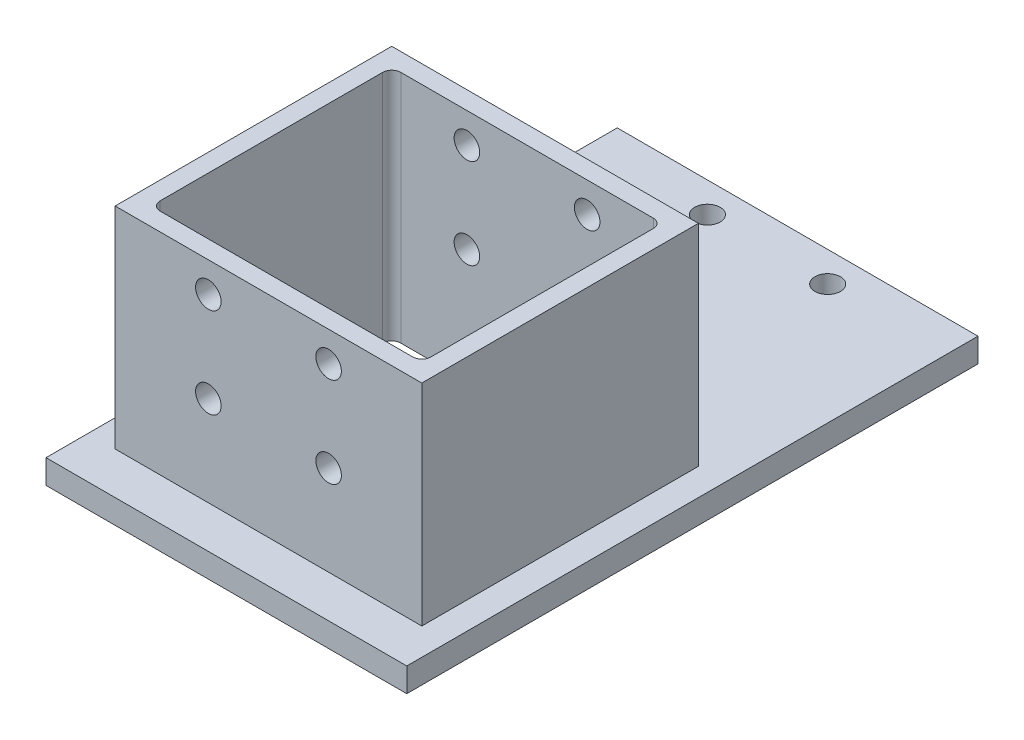
ISO-10303-21;
HEADER;
FILE_DESCRIPTION(('STEP AP214'),'2;1');
FILE_NAME('part.step','',(''),(''),'','','');
FILE_SCHEMA(('AUTOMOTIVE_DESIGN { 1 0 10303 214 1 1 1 1 }'));
ENDSEC;
DATA;
#1=APPLICATION_CONTEXT('core data for automotive mechanical design processes');
#2=APPLICATION_PROTOCOL_DEFINITION('international standard','automotive_design',2000,#1);
#3=PRODUCT_CONTEXT('',#1,'mechanical');
#4=PRODUCT('Part','Part','',(#3));
#5=PRODUCT_RELATED_PRODUCT_CATEGORY('part','',(#4));
#6=PRODUCT_DEFINITION_FORMATION('','',#4);
#7=PRODUCT_DEFINITION_CONTEXT('part definition',#1,'design');
#8=PRODUCT_DEFINITION('design','',#6,#7);
#9=PRODUCT_DEFINITION_SHAPE('','',#8);
#10=(LENGTH_UNIT() NAMED_UNIT(*) SI_UNIT(.MILLI.,.METRE.));
#11=(NAMED_UNIT(*) PLANE_ANGLE_UNIT() SI_UNIT($,.RADIAN.));
#12=(NAMED_UNIT(*) SI_UNIT($,.STERADIAN.) SOLID_ANGLE_UNIT());
#13=UNCERTAINTY_MEASURE_WITH_UNIT(LENGTH_MEASURE(1.E-05),#10,'distance_accuracy_value','');
#14=(GEOMETRIC_REPRESENTATION_CONTEXT(3) GLOBAL_UNCERTAINTY_ASSIGNED_CONTEXT((#13)) GLOBAL_UNIT_ASSIGNED_CONTEXT((#10,
#11,#12)) REPRESENTATION_CONTEXT('',''));
#15=CARTESIAN_POINT('',(0.,0.,0.));
#16=DIRECTION('',(0.,0.,1.));
#17=DIRECTION('',(1.,0.,0.));
#18=AXIS2_PLACEMENT_3D('',#15,#16,#17);
#19=CARTESIAN_POINT('',(0.,8.,0.));
#20=DIRECTION('',(0.,1.,0.));
#21=DIRECTION('',(0.,0.,1.));
#22=AXIS2_PLACEMENT_3D('',#19,#20,#21);
#23=PLANE('',#22);
#24=CARTESIAN_POINT('',(-20.,8.,-25.));
#25=DIRECTION('',(0.,1.,0.));
#26=DIRECTION('',(0.,0.,-1.));
#27=AXIS2_PLACEMENT_3D('',#24,#25,#26);
#28=CIRCLE('',#27,4.25);
#29=CARTESIAN_POINT('',(-20.,8.,-29.25));
#30=VERTEX_POINT('',#29);
#31=EDGE_CURVE('E177',#30,#30,#28,.T.);
#32=ORIENTED_EDGE('',*,*,#31,.F.);
#33=EDGE_LOOP('',(#32));
#34=FACE_BOUND('',#33,.T.);
#35=CARTESIAN_POINT('',(20.,8.,-25.));
#36=DIRECTION('',(0.,1.,0.));
#37=DIRECTION('',(0.,0.,1.));
#38=AXIS2_PLACEMENT_3D('',#35,#36,#37);
#39=CIRCLE('',#38,4.25);
#40=CARTESIAN_POINT('',(20.,8.,-20.75));
#41=VERTEX_POINT('',#40);
#42=EDGE_CURVE('E204',#41,#41,#39,.T.);
#43=ORIENTED_EDGE('',*,*,#42,.F.);
#44=EDGE_LOOP('',(#43));
#45=FACE_BOUND('',#44,.T.);
#46=DIRECTION('',(0.,0.,1.));
#47=VECTOR('',#46,1.);
#48=CARTESIAN_POINT('',(-60.,8.,-95.));
#49=LINE('',#48,#47);
#50=CARTESIAN_POINT('',(-60.,8.,-95.));
#51=VERTEX_POINT('',#50);
#52=CARTESIAN_POINT('',(-60.,8.,95.));
#53=VERTEX_POINT('',#52);
#54=EDGE_CURVE('E216',#51,#53,#49,.T.);
#55=ORIENTED_EDGE('',*,*,#54,.T.);
#56=DIRECTION('',(1.,0.,0.));
#57=VECTOR('',#56,1.);
#58=CARTESIAN_POINT('',(-60.,8.,95.));
#59=LINE('',#58,#57);
#60=CARTESIAN_POINT('',(60.,8.,95.));
#61=VERTEX_POINT('',#60);
#62=EDGE_CURVE('E219',#53,#61,#59,.T.);
#63=ORIENTED_EDGE('',*,*,#62,.T.);
#64=DIRECTION('',(0.,0.,-1.));
#65=VECTOR('',#64,1.);
#66=CARTESIAN_POINT('',(60.,8.,-95.));
#67=LINE('',#66,#65);
#68=CARTESIAN_POINT('',(60.,8.,-95.));
#69=VERTEX_POINT('',#68);
#70=EDGE_CURVE('E222',#61,#69,#67,.T.);
#71=ORIENTED_EDGE('',*,*,#70,.T.);
#72=DIRECTION('',(-1.,0.,0.));
#73=VECTOR('',#72,1.);
#74=CARTESIAN_POINT('',(-60.,8.,-95.));
#75=LINE('',#74,#73);
#76=EDGE_CURVE('E224',#69,#51,#75,.T.);
#77=ORIENTED_EDGE('',*,*,#76,.T.);
#78=EDGE_LOOP('',(#55,#63,#71,#77));
#79=FACE_BOUND('',#78,.T.);
#80=CARTESIAN_POINT('',(20.,8.,-85.));
#81=DIRECTION('',(0.,1.,0.));
#82=DIRECTION('',(0.,0.,1.));
#83=AXIS2_PLACEMENT_3D('',#80,#81,#82);
#84=CIRCLE('',#83,4.25000000000001);
#85=CARTESIAN_POINT('',(20.,8.,-80.75));
#86=VERTEX_POINT('',#85);
#87=EDGE_CURVE('E210',#86,#86,#84,.T.);
#88=ORIENTED_EDGE('',*,*,#87,.F.);
#89=EDGE_LOOP('',(#88));
#90=FACE_BOUND('',#89,.T.);
#91=CARTESIAN_POINT('',(-20.,8.,-85.));
#92=DIRECTION('',(0.,1.,0.));
#93=DIRECTION('',(0.,0.,-1.));
#94=AXIS2_PLACEMENT_3D('',#91,#92,#93);
#95=CIRCLE('',#94,4.25000000000001);
#96=CARTESIAN_POINT('',(-20.,8.,-89.25));
#97=VERTEX_POINT('',#96);
#98=EDGE_CURVE('E186',#97,#97,#95,.T.);
#99=ORIENTED_EDGE('',*,*,#98,.F.);
#100=EDGE_LOOP('',(#99));
#101=FACE_BOUND('',#100,.T.);
#102=DIRECTION('',(1.,0.,0.));
#103=VECTOR('',#102,1.);
#104=CARTESIAN_POINT('',(-51.,8.,81.));
#105=LINE('',#104,#103);
#106=CARTESIAN_POINT('',(-51.,8.,81.));
#107=VERTEX_POINT('',#106);
#108=CARTESIAN_POINT('',(51.,8.,81.));
#109=VERTEX_POINT('',#108);
#110=EDGE_CURVE('E304',#107,#109,#105,.T.);
#111=ORIENTED_EDGE('',*,*,#110,.F.);
#112=DIRECTION('',(0.,0.,1.));
#113=VECTOR('',#112,1.);
#114=CARTESIAN_POINT('',(-51.,8.,-11.));
#115=LINE('',#114,#113);
#116=CARTESIAN_POINT('',(-51.,8.,-11.));
#117=VERTEX_POINT('',#116);
#118=EDGE_CURVE('E172',#117,#107,#115,.T.);
#119=ORIENTED_EDGE('',*,*,#118,.F.);
#120=DIRECTION('',(-1.,0.,0.));
#121=VECTOR('',#120,1.);
#122=CARTESIAN_POINT('',(-51.,8.,-11.));
#123=LINE('',#122,#121);
#124=CARTESIAN_POINT('',(51.,8.,-11.));
#125=VERTEX_POINT('',#124);
#126=EDGE_CURVE('E168',#125,#117,#123,.T.);
#127=ORIENTED_EDGE('',*,*,#126,.F.);
#128=DIRECTION('',(0.,0.,-1.));
#129=VECTOR('',#128,1.);
#130=CARTESIAN_POINT('',(51.,8.,-11.));
#131=LINE('',#130,#129);
#132=EDGE_CURVE('E306',#109,#125,#131,.T.);
#133=ORIENTED_EDGE('',*,*,#132,.F.);
#134=EDGE_LOOP('',(#111,#119,#127,#133));
#135=FACE_BOUND('',#134,.T.);
#136=ADVANCED_FACE('F35',(#34,#45,#79,#90,#101,#135),#23,.T.);
#137=CARTESIAN_POINT('',(0.,0.,0.));
#138=DIRECTION('',(0.,1.,0.));
#139=DIRECTION('',(0.,0.,1.));
#140=AXIS2_PLACEMENT_3D('',#137,#138,#139);
#141=PLANE('',#140);
#142=CARTESIAN_POINT('',(20.,0.,-25.));
#143=DIRECTION('',(0.,1.,0.));
#144=DIRECTION('',(0.,0.,1.));
#145=AXIS2_PLACEMENT_3D('',#142,#143,#144);
#146=CIRCLE('',#145,4.25);
#147=CARTESIAN_POINT('',(20.,0.,-20.75));
#148=VERTEX_POINT('',#147);
#149=EDGE_CURVE('E203',#148,#148,#146,.T.);
#150=ORIENTED_EDGE('',*,*,#149,.T.);
#151=EDGE_LOOP('',(#150));
#152=FACE_BOUND('',#151,.T.);
#153=CARTESIAN_POINT('',(20.,0.,-85.));
#154=DIRECTION('',(0.,1.,0.));
#155=DIRECTION('',(0.,0.,1.));
#156=AXIS2_PLACEMENT_3D('',#153,#154,#155);
#157=CIRCLE('',#156,4.25000000000001);
#158=CARTESIAN_POINT('',(20.,0.,-80.75));
#159=VERTEX_POINT('',#158);
#160=EDGE_CURVE('E207',#159,#159,#157,.T.);
#161=ORIENTED_EDGE('',*,*,#160,.T.);
#162=EDGE_LOOP('',(#161));
#163=FACE_BOUND('',#162,.T.);
#164=DIRECTION('',(0.,0.,1.));
#165=VECTOR('',#164,1.);
#166=CARTESIAN_POINT('',(-60.,0.,-95.));
#167=LINE('',#166,#165);
#168=CARTESIAN_POINT('',(-60.,0.,-95.));
#169=VERTEX_POINT('',#168);
#170=CARTESIAN_POINT('',(-60.,0.,95.));
#171=VERTEX_POINT('',#170);
#172=EDGE_CURVE('E213',#169,#171,#167,.T.);
#173=ORIENTED_EDGE('',*,*,#172,.F.);
#174=DIRECTION('',(-1.,0.,0.));
#175=VECTOR('',#174,1.);
#176=CARTESIAN_POINT('',(-60.,0.,-95.));
#177=LINE('',#176,#175);
#178=CARTESIAN_POINT('',(60.,0.,-95.));
#179=VERTEX_POINT('',#178);
#180=EDGE_CURVE('E220',#179,#169,#177,.T.);
#181=ORIENTED_EDGE('',*,*,#180,.F.);
#182=DIRECTION('',(0.,0.,-1.));
#183=VECTOR('',#182,1.);
#184=CARTESIAN_POINT('',(60.,0.,-95.));
#185=LINE('',#184,#183);
#186=CARTESIAN_POINT('',(60.,0.,95.));
#187=VERTEX_POINT('',#186);
#188=EDGE_CURVE('E231',#187,#179,#185,.T.);
#189=ORIENTED_EDGE('',*,*,#188,.F.);
#190=DIRECTION('',(1.,0.,0.));
#191=VECTOR('',#190,1.);
#192=CARTESIAN_POINT('',(-60.,0.,95.));
#193=LINE('',#192,#191);
#194=EDGE_CURVE('E229',#171,#187,#193,.T.);
#195=ORIENTED_EDGE('',*,*,#194,.F.);
#196=EDGE_LOOP('',(#173,#181,#189,#195));
#197=FACE_BOUND('',#196,.T.);
#198=DIRECTION('',(-1.,0.,0.));
#199=VECTOR('',#198,1.);
#200=CARTESIAN_POINT('',(-45.,0.,-5.));
#201=LINE('',#200,#199);
#202=CARTESIAN_POINT('',(42.,0.,-5.00000000000001));
#203=VERTEX_POINT('',#202);
#204=CARTESIAN_POINT('',(-42.,0.,-5.));
#205=VERTEX_POINT('',#204);
#206=EDGE_CURVE('E200',#203,#205,#201,.T.);
#207=ORIENTED_EDGE('',*,*,#206,.T.);
#208=CARTESIAN_POINT('',(-42.,0.,-2.));
#209=DIRECTION('',(0.,1.,0.));
#210=DIRECTION('',(0.,0.,1.));
#211=AXIS2_PLACEMENT_3D('',#208,#209,#210);
#212=CIRCLE('',#211,3.);
#213=CARTESIAN_POINT('',(-45.,0.,-2.));
#214=VERTEX_POINT('',#213);
#215=EDGE_CURVE('E272',#205,#214,#212,.T.);
#216=ORIENTED_EDGE('',*,*,#215,.T.);
#217=DIRECTION('',(0.,0.,1.));
#218=VECTOR('',#217,1.);
#219=CARTESIAN_POINT('',(-45.,0.,-5.));
#220=LINE('',#219,#218);
#221=CARTESIAN_POINT('',(-45.,0.,72.));
#222=VERTEX_POINT('',#221);
#223=EDGE_CURVE('E189',#214,#222,#220,.T.);
#224=ORIENTED_EDGE('',*,*,#223,.T.);
#225=CARTESIAN_POINT('',(-42.,0.,72.));
#226=DIRECTION('',(0.,1.,0.));
#227=DIRECTION('',(0.,0.,1.));
#228=AXIS2_PLACEMENT_3D('',#225,#226,#227);
#229=CIRCLE('',#228,3.);
#230=CARTESIAN_POINT('',(-42.,0.,75.));
#231=VERTEX_POINT('',#230);
#232=EDGE_CURVE('E268',#222,#231,#229,.T.);
#233=ORIENTED_EDGE('',*,*,#232,.T.);
#234=DIRECTION('',(1.,0.,0.));
#235=VECTOR('',#234,1.);
#236=CARTESIAN_POINT('',(-45.,0.,75.));
#237=LINE('',#236,#235);
#238=CARTESIAN_POINT('',(42.,0.,75.));
#239=VERTEX_POINT('',#238);
#240=EDGE_CURVE('E194',#231,#239,#237,.T.);
#241=ORIENTED_EDGE('',*,*,#240,.T.);
#242=CARTESIAN_POINT('',(42.,0.,72.));
#243=DIRECTION('',(0.,1.,0.));
#244=DIRECTION('',(0.,0.,1.));
#245=AXIS2_PLACEMENT_3D('',#242,#243,#244);
#246=CIRCLE('',#245,3.);
#247=CARTESIAN_POINT('',(45.,0.,72.));
#248=VERTEX_POINT('',#247);
#249=EDGE_CURVE('E264',#239,#248,#246,.T.);
#250=ORIENTED_EDGE('',*,*,#249,.T.);
#251=DIRECTION('',(0.,0.,-1.));
#252=VECTOR('',#251,1.);
#253=CARTESIAN_POINT('',(45.,0.,-5.00000000000001));
#254=LINE('',#253,#252);
#255=CARTESIAN_POINT('',(45.,0.,-2.00000000000001));
#256=VERTEX_POINT('',#255);
#257=EDGE_CURVE('E197',#248,#256,#254,.T.);
#258=ORIENTED_EDGE('',*,*,#257,.T.);
#259=CARTESIAN_POINT('',(42.,0.,-2.00000000000001));
#260=DIRECTION('',(0.,1.,0.));
#261=DIRECTION('',(0.,0.,1.));
#262=AXIS2_PLACEMENT_3D('',#259,#260,#261);
#263=CIRCLE('',#262,3.);
#264=EDGE_CURVE('E43',#256,#203,#263,.T.);
#265=ORIENTED_EDGE('',*,*,#264,.T.);
#266=EDGE_LOOP('',(#207,#216,#224,#233,#241,#250,#258,#265));
#267=FACE_BOUND('',#266,.T.);
#268=CARTESIAN_POINT('',(-20.,0.,-85.));
#269=DIRECTION('',(0.,1.,0.));
#270=DIRECTION('',(0.,0.,-1.));
#271=AXIS2_PLACEMENT_3D('',#268,#269,#270);
#272=CIRCLE('',#271,4.25000000000001);
#273=CARTESIAN_POINT('',(-20.,0.,-89.25));
#274=VERTEX_POINT('',#273);
#275=EDGE_CURVE('E184',#274,#274,#272,.T.);
#276=ORIENTED_EDGE('',*,*,#275,.T.);
#277=EDGE_LOOP('',(#276));
#278=FACE_BOUND('',#277,.T.);
#279=CARTESIAN_POINT('',(-20.,0.,-25.));
#280=DIRECTION('',(0.,1.,0.));
#281=DIRECTION('',(0.,0.,-1.));
#282=AXIS2_PLACEMENT_3D('',#279,#280,#281);
#283=CIRCLE('',#282,4.25);
#284=CARTESIAN_POINT('',(-20.,0.,-29.25));
#285=VERTEX_POINT('',#284);
#286=EDGE_CURVE('E174',#285,#285,#283,.T.);
#287=ORIENTED_EDGE('',*,*,#286,.T.);
#288=EDGE_LOOP('',(#287));
#289=FACE_BOUND('',#288,.T.);
#290=ADVANCED_FACE('F275',(#152,#163,#197,#267,#278,#289),#141,.F.);
#291=CARTESIAN_POINT('',(-60.,8.,-95.));
#292=DIRECTION('',(1.,0.,0.));
#293=DIRECTION('',(0.,0.,-1.));
#294=AXIS2_PLACEMENT_3D('',#291,#292,#293);
#295=PLANE('',#294);
#296=ORIENTED_EDGE('',*,*,#172,.T.);
#297=DIRECTION('',(0.,-1.,0.));
#298=VECTOR('',#297,1.);
#299=CARTESIAN_POINT('',(-60.,8.,95.));
#300=LINE('',#299,#298);
#301=EDGE_CURVE('E242',#53,#171,#300,.T.);
#302=ORIENTED_EDGE('',*,*,#301,.F.);
#303=ORIENTED_EDGE('',*,*,#54,.F.);
#304=DIRECTION('',(0.,-1.,0.));
#305=VECTOR('',#304,1.);
#306=CARTESIAN_POINT('',(-60.,8.,-95.));
#307=LINE('',#306,#305);
#308=EDGE_CURVE('E226',#51,#169,#307,.T.);
#309=ORIENTED_EDGE('',*,*,#308,.T.);
#310=EDGE_LOOP('',(#296,#302,#303,#309));
#311=FACE_BOUND('',#310,.T.);
#312=ADVANCED_FACE('F324',(#311),#295,.F.);
#313=CARTESIAN_POINT('',(-60.,8.,95.));
#314=DIRECTION('',(0.,0.,-1.));
#315=DIRECTION('',(-1.,0.,0.));
#316=AXIS2_PLACEMENT_3D('',#313,#314,#315);
#317=PLANE('',#316);
#318=ORIENTED_EDGE('',*,*,#194,.T.);
#319=DIRECTION('',(0.,-1.,0.));
#320=VECTOR('',#319,1.);
#321=CARTESIAN_POINT('',(60.,8.,95.));
#322=LINE('',#321,#320);
#323=EDGE_CURVE('E239',#61,#187,#322,.T.);
#324=ORIENTED_EDGE('',*,*,#323,.F.);
#325=ORIENTED_EDGE('',*,*,#62,.F.);
#326=ORIENTED_EDGE('',*,*,#301,.T.);
#327=EDGE_LOOP('',(#318,#324,#325,#326));
#328=FACE_BOUND('',#327,.T.);
#329=ADVANCED_FACE('F340',(#328),#317,.F.);
#330=CARTESIAN_POINT('',(60.,8.,-95.));
#331=DIRECTION('',(-1.,0.,0.));
#332=DIRECTION('',(0.,0.,1.));
#333=AXIS2_PLACEMENT_3D('',#330,#331,#332);
#334=PLANE('',#333);
#335=ORIENTED_EDGE('',*,*,#188,.T.);
#336=DIRECTION('',(0.,-1.,0.));
#337=VECTOR('',#336,1.);
#338=CARTESIAN_POINT('',(60.,8.,-95.));
#339=LINE('',#338,#337);
#340=EDGE_CURVE('E236',#69,#179,#339,.T.);
#341=ORIENTED_EDGE('',*,*,#340,.F.);
#342=ORIENTED_EDGE('',*,*,#70,.F.);
#343=ORIENTED_EDGE('',*,*,#323,.T.);
#344=EDGE_LOOP('',(#335,#341,#342,#343));
#345=FACE_BOUND('',#344,.T.);
#346=ADVANCED_FACE('F336',(#345),#334,.F.);
#347=CARTESIAN_POINT('',(-60.,8.,-95.));
#348=DIRECTION('',(0.,0.,1.));
#349=DIRECTION('',(1.,0.,0.));
#350=AXIS2_PLACEMENT_3D('',#347,#348,#349);
#351=PLANE('',#350);
#352=ORIENTED_EDGE('',*,*,#180,.T.);
#353=ORIENTED_EDGE('',*,*,#308,.F.);
#354=ORIENTED_EDGE('',*,*,#76,.F.);
#355=ORIENTED_EDGE('',*,*,#340,.T.);
#356=EDGE_LOOP('',(#352,#353,#354,#355));
#357=FACE_BOUND('',#356,.T.);
#358=ADVANCED_FACE('F333',(#357),#351,.F.);
#359=CARTESIAN_POINT('',(20.,8.,-85.));
#360=DIRECTION('',(0.,-1.,0.));
#361=DIRECTION('',(0.,0.,-1.));
#362=AXIS2_PLACEMENT_3D('',#359,#360,#361);
#363=CYLINDRICAL_SURFACE('',#362,4.25000000000001);
#364=ORIENTED_EDGE('',*,*,#87,.T.);
#365=EDGE_LOOP('',(#364));
#366=FACE_BOUND('',#365,.T.);
#367=ORIENTED_EDGE('',*,*,#160,.F.);
#368=EDGE_LOOP('',(#367));
#369=FACE_BOUND('',#368,.T.);
#370=ADVANCED_FACE('F330',(#366,#369),#363,.F.);
#371=CARTESIAN_POINT('',(20.,8.,-25.));
#372=DIRECTION('',(0.,-1.,0.));
#373=DIRECTION('',(0.,0.,-1.));
#374=AXIS2_PLACEMENT_3D('',#371,#372,#373);
#375=CYLINDRICAL_SURFACE('',#374,4.25);
#376=ORIENTED_EDGE('',*,*,#42,.T.);
#377=EDGE_LOOP('',(#376));
#378=FACE_BOUND('',#377,.T.);
#379=ORIENTED_EDGE('',*,*,#149,.F.);
#380=EDGE_LOOP('',(#379));
#381=FACE_BOUND('',#380,.T.);
#382=ADVANCED_FACE('F488',(#378,#381),#375,.F.);
#383=CARTESIAN_POINT('',(-45.,8.,-5.));
#384=DIRECTION('',(1.,0.,0.));
#385=DIRECTION('',(0.,0.,-1.));
#386=AXIS2_PLACEMENT_3D('',#383,#384,#385);
#387=PLANE('',#386);
#388=DIRECTION('',(0.,0.,1.));
#389=VECTOR('',#388,1.);
#390=CARTESIAN_POINT('',(-45.,78.,-5.));
#391=LINE('',#390,#389);
#392=CARTESIAN_POINT('',(-45.,78.,-2.));
#393=VERTEX_POINT('',#392);
#394=CARTESIAN_POINT('',(-45.,78.,72.));
#395=VERTEX_POINT('',#394);
#396=EDGE_CURVE('E296',#393,#395,#391,.T.);
#397=ORIENTED_EDGE('',*,*,#396,.T.);
#398=DIRECTION('',(0.,-1.,0.));
#399=VECTOR('',#398,1.);
#400=CARTESIAN_POINT('',(-45.,0.,72.));
#401=LINE('',#400,#399);
#402=EDGE_CURVE('E257',#395,#222,#401,.T.);
#403=ORIENTED_EDGE('',*,*,#402,.T.);
#404=ORIENTED_EDGE('',*,*,#223,.F.);
#405=DIRECTION('',(0.,-1.,0.));
#406=VECTOR('',#405,1.);
#407=CARTESIAN_POINT('',(-45.,78.,-2.));
#408=LINE('',#407,#406);
#409=EDGE_CURVE('E255',#214,#393,#408,.F.);
#410=ORIENTED_EDGE('',*,*,#409,.T.);
#411=EDGE_LOOP('',(#397,#403,#404,#410));
#412=FACE_BOUND('',#411,.T.);
#413=ADVANCED_FACE('F366',(#412),#387,.T.);
#414=CARTESIAN_POINT('',(-45.,8.,75.));
#415=DIRECTION('',(0.,0.,-1.));
#416=DIRECTION('',(-1.,0.,0.));
#417=AXIS2_PLACEMENT_3D('',#414,#415,#416);
#418=PLANE('',#417);
#419=CARTESIAN_POINT('',(20.,68.,75.));
#420=DIRECTION('',(0.,0.,-1.));
#421=DIRECTION('',(-1.,0.,0.));
#422=AXIS2_PLACEMENT_3D('',#419,#420,#421);
#423=CIRCLE('',#422,4.25);
#424=CARTESIAN_POINT('',(15.75,68.,75.));
#425=VERTEX_POINT('',#424);
#426=EDGE_CURVE('E374',#425,#425,#423,.T.);
#427=ORIENTED_EDGE('',*,*,#426,.F.);
#428=EDGE_LOOP('',(#427));
#429=FACE_BOUND('',#428,.T.);
#430=CARTESIAN_POINT('',(20.,38.,75.));
#431=DIRECTION('',(0.,0.,-1.));
#432=DIRECTION('',(-1.,0.,0.));
#433=AXIS2_PLACEMENT_3D('',#430,#431,#432);
#434=CIRCLE('',#433,4.25);
#435=CARTESIAN_POINT('',(15.75,38.,75.));
#436=VERTEX_POINT('',#435);
#437=EDGE_CURVE('E384',#436,#436,#434,.T.);
#438=ORIENTED_EDGE('',*,*,#437,.F.);
#439=EDGE_LOOP('',(#438));
#440=FACE_BOUND('',#439,.T.);
#441=CARTESIAN_POINT('',(-20.,38.,75.));
#442=DIRECTION('',(0.,0.,-1.));
#443=DIRECTION('',(-1.,0.,0.));
#444=AXIS2_PLACEMENT_3D('',#441,#442,#443);
#445=CIRCLE('',#444,4.25);
#446=CARTESIAN_POINT('',(-24.25,38.,75.));
#447=VERTEX_POINT('',#446);
#448=EDGE_CURVE('E393',#447,#447,#445,.T.);
#449=ORIENTED_EDGE('',*,*,#448,.F.);
#450=EDGE_LOOP('',(#449));
#451=FACE_BOUND('',#450,.T.);
#452=CARTESIAN_POINT('',(-20.,68.,75.));
#453=DIRECTION('',(0.,0.,-1.));
#454=DIRECTION('',(-1.,0.,0.));
#455=AXIS2_PLACEMENT_3D('',#452,#453,#454);
#456=CIRCLE('',#455,4.25);
#457=CARTESIAN_POINT('',(-24.25,68.,75.));
#458=VERTEX_POINT('',#457);
#459=EDGE_CURVE('E402',#458,#458,#456,.T.);
#460=ORIENTED_EDGE('',*,*,#459,.F.);
#461=EDGE_LOOP('',(#460));
#462=FACE_BOUND('',#461,.T.);
#463=DIRECTION('',(1.,0.,0.));
#464=VECTOR('',#463,1.);
#465=CARTESIAN_POINT('',(-45.,78.,75.));
#466=LINE('',#465,#464);
#467=CARTESIAN_POINT('',(-42.,78.,75.));
#468=VERTEX_POINT('',#467);
#469=CARTESIAN_POINT('',(42.,78.,75.));
#470=VERTEX_POINT('',#469);
#471=EDGE_CURVE('E292',#468,#470,#466,.T.);
#472=ORIENTED_EDGE('',*,*,#471,.T.);
#473=DIRECTION('',(0.,-1.,0.));
#474=VECTOR('',#473,1.);
#475=CARTESIAN_POINT('',(42.,0.,75.));
#476=LINE('',#475,#474);
#477=EDGE_CURVE('E247',#470,#239,#476,.T.);
#478=ORIENTED_EDGE('',*,*,#477,.T.);
#479=ORIENTED_EDGE('',*,*,#240,.F.);
#480=DIRECTION('',(0.,-1.,0.));
#481=VECTOR('',#480,1.);
#482=CARTESIAN_POINT('',(-42.,78.,75.));
#483=LINE('',#482,#481);
#484=EDGE_CURVE('E245',#231,#468,#483,.F.);
#485=ORIENTED_EDGE('',*,*,#484,.T.);
#486=EDGE_LOOP('',(#472,#478,#479,#485));
#487=FACE_BOUND('',#486,.T.);
#488=ADVANCED_FACE('F372',(#429,#440,#451,#462,#487),#418,.T.);
#489=CARTESIAN_POINT('',(45.,8.,-5.00000000000001));
#490=DIRECTION('',(-1.,0.,0.));
#491=DIRECTION('',(0.,0.,1.));
#492=AXIS2_PLACEMENT_3D('',#489,#490,#491);
#493=PLANE('',#492);
#494=ORIENTED_EDGE('',*,*,#257,.F.);
#495=DIRECTION('',(0.,-1.,0.));
#496=VECTOR('',#495,1.);
#497=CARTESIAN_POINT('',(45.,78.,72.));
#498=LINE('',#497,#496);
#499=CARTESIAN_POINT('',(45.,78.,72.));
#500=VERTEX_POINT('',#499);
#501=EDGE_CURVE('E253',#248,#500,#498,.F.);
#502=ORIENTED_EDGE('',*,*,#501,.T.);
#503=DIRECTION('',(0.,0.,-1.));
#504=VECTOR('',#503,1.);
#505=CARTESIAN_POINT('',(45.,78.,75.));
#506=LINE('',#505,#504);
#507=CARTESIAN_POINT('',(45.,78.,-2.00000000000002));
#508=VERTEX_POINT('',#507);
#509=EDGE_CURVE('E286',#500,#508,#506,.T.);
#510=ORIENTED_EDGE('',*,*,#509,.T.);
#511=DIRECTION('',(0.,-1.,0.));
#512=VECTOR('',#511,1.);
#513=CARTESIAN_POINT('',(45.,0.,-2.00000000000001));
#514=LINE('',#513,#512);
#515=EDGE_CURVE('E250',#508,#256,#514,.T.);
#516=ORIENTED_EDGE('',*,*,#515,.T.);
#517=EDGE_LOOP('',(#494,#502,#510,#516));
#518=FACE_BOUND('',#517,.T.);
#519=ADVANCED_FACE('F290',(#518),#493,.T.);
#520=CARTESIAN_POINT('',(-45.,8.,-5.));
#521=DIRECTION('',(0.,0.,1.));
#522=DIRECTION('',(1.,0.,0.));
#523=AXIS2_PLACEMENT_3D('',#520,#521,#522);
#524=PLANE('',#523);
#525=CARTESIAN_POINT('',(20.,68.,-5.00000000000002));
#526=DIRECTION('',(0.,0.,1.));
#527=DIRECTION('',(1.,0.,0.));
#528=AXIS2_PLACEMENT_3D('',#525,#526,#527);
#529=CIRCLE('',#528,4.25);
#530=CARTESIAN_POINT('',(24.25,68.,-5.00000000000002));
#531=VERTEX_POINT('',#530);
#532=EDGE_CURVE('E376',#531,#531,#529,.T.);
#533=ORIENTED_EDGE('',*,*,#532,.F.);
#534=EDGE_LOOP('',(#533));
#535=FACE_BOUND('',#534,.T.);
#536=CARTESIAN_POINT('',(20.,38.,-5.00000000000002));
#537=DIRECTION('',(0.,0.,1.));
#538=DIRECTION('',(1.,0.,0.));
#539=AXIS2_PLACEMENT_3D('',#536,#537,#538);
#540=CIRCLE('',#539,4.25);
#541=CARTESIAN_POINT('',(24.25,38.,-5.00000000000002));
#542=VERTEX_POINT('',#541);
#543=EDGE_CURVE('E387',#542,#542,#540,.T.);
#544=ORIENTED_EDGE('',*,*,#543,.F.);
#545=EDGE_LOOP('',(#544));
#546=FACE_BOUND('',#545,.T.);
#547=CARTESIAN_POINT('',(-20.,38.,-5.));
#548=DIRECTION('',(0.,0.,1.));
#549=DIRECTION('',(1.,0.,0.));
#550=AXIS2_PLACEMENT_3D('',#547,#548,#549);
#551=CIRCLE('',#550,4.25);
#552=CARTESIAN_POINT('',(-15.75,38.,-5.00000000000001));
#553=VERTEX_POINT('',#552);
#554=EDGE_CURVE('E396',#553,#553,#551,.T.);
#555=ORIENTED_EDGE('',*,*,#554,.F.);
#556=EDGE_LOOP('',(#555));
#557=FACE_BOUND('',#556,.T.);
#558=CARTESIAN_POINT('',(-20.,68.,-5.));
#559=DIRECTION('',(0.,0.,1.));
#560=DIRECTION('',(1.,0.,0.));
#561=AXIS2_PLACEMENT_3D('',#558,#559,#560);
#562=CIRCLE('',#561,4.25);
#563=CARTESIAN_POINT('',(-15.75,68.,-5.00000000000001));
#564=VERTEX_POINT('',#563);
#565=EDGE_CURVE('E405',#564,#564,#562,.T.);
#566=ORIENTED_EDGE('',*,*,#565,.F.);
#567=EDGE_LOOP('',(#566));
#568=FACE_BOUND('',#567,.T.);
#569=DIRECTION('',(-1.,0.,0.));
#570=VECTOR('',#569,1.);
#571=CARTESIAN_POINT('',(45.,78.,-5.00000000000001));
#572=LINE('',#571,#570);
#573=CARTESIAN_POINT('',(42.,78.,-5.00000000000001));
#574=VERTEX_POINT('',#573);
#575=CARTESIAN_POINT('',(-42.,78.,-5.));
#576=VERTEX_POINT('',#575);
#577=EDGE_CURVE('E288',#574,#576,#572,.T.);
#578=ORIENTED_EDGE('',*,*,#577,.T.);
#579=DIRECTION('',(0.,-1.,0.));
#580=VECTOR('',#579,1.);
#581=CARTESIAN_POINT('',(-42.,0.,-5.));
#582=LINE('',#581,#580);
#583=EDGE_CURVE('E261',#576,#205,#582,.T.);
#584=ORIENTED_EDGE('',*,*,#583,.T.);
#585=ORIENTED_EDGE('',*,*,#206,.F.);
#586=DIRECTION('',(0.,-1.,0.));
#587=VECTOR('',#586,1.);
#588=CARTESIAN_POINT('',(42.,78.,-5.00000000000001));
#589=LINE('',#588,#587);
#590=EDGE_CURVE('E57',#203,#574,#589,.F.);
#591=ORIENTED_EDGE('',*,*,#590,.T.);
#592=EDGE_LOOP('',(#578,#584,#585,#591));
#593=FACE_BOUND('',#592,.T.);
#594=ADVANCED_FACE('F280',(#535,#546,#557,#568,#593),#524,.T.);
#595=CARTESIAN_POINT('',(-20.,8.,-85.));
#596=DIRECTION('',(0.,-1.,0.));
#597=DIRECTION('',(0.,0.,-1.));
#598=AXIS2_PLACEMENT_3D('',#595,#596,#597);
#599=CYLINDRICAL_SURFACE('',#598,4.25000000000001);
#600=ORIENTED_EDGE('',*,*,#98,.T.);
#601=EDGE_LOOP('',(#600));
#602=FACE_BOUND('',#601,.T.);
#603=ORIENTED_EDGE('',*,*,#275,.F.);
#604=EDGE_LOOP('',(#603));
#605=FACE_BOUND('',#604,.T.);
#606=ADVANCED_FACE('F474',(#602,#605),#599,.F.);
#607=CARTESIAN_POINT('',(-20.,8.,-25.));
#608=DIRECTION('',(0.,-1.,0.));
#609=DIRECTION('',(0.,0.,-1.));
#610=AXIS2_PLACEMENT_3D('',#607,#608,#609);
#611=CYLINDRICAL_SURFACE('',#610,4.25);
#612=ORIENTED_EDGE('',*,*,#31,.T.);
#613=EDGE_LOOP('',(#612));
#614=FACE_BOUND('',#613,.T.);
#615=ORIENTED_EDGE('',*,*,#286,.F.);
#616=EDGE_LOOP('',(#615));
#617=FACE_BOUND('',#616,.T.);
#618=ADVANCED_FACE('F471',(#614,#617),#611,.F.);
#619=CARTESIAN_POINT('',(0.,78.,0.));
#620=DIRECTION('',(0.,1.,0.));
#621=DIRECTION('',(0.,0.,1.));
#622=AXIS2_PLACEMENT_3D('',#619,#620,#621);
#623=PLANE('',#622);
#624=DIRECTION('',(0.,0.,1.));
#625=VECTOR('',#624,1.);
#626=CARTESIAN_POINT('',(-51.,78.,-11.));
#627=LINE('',#626,#625);
#628=CARTESIAN_POINT('',(-51.,78.,-11.));
#629=VERTEX_POINT('',#628);
#630=CARTESIAN_POINT('',(-51.,78.,81.));
#631=VERTEX_POINT('',#630);
#632=EDGE_CURVE('E159',#629,#631,#627,.T.);
#633=ORIENTED_EDGE('',*,*,#632,.T.);
#634=DIRECTION('',(1.,0.,0.));
#635=VECTOR('',#634,1.);
#636=CARTESIAN_POINT('',(-51.,78.,81.));
#637=LINE('',#636,#635);
#638=CARTESIAN_POINT('',(51.,78.,81.));
#639=VERTEX_POINT('',#638);
#640=EDGE_CURVE('E148',#631,#639,#637,.T.);
#641=ORIENTED_EDGE('',*,*,#640,.T.);
#642=DIRECTION('',(0.,0.,-1.));
#643=VECTOR('',#642,1.);
#644=CARTESIAN_POINT('',(51.,78.,-11.));
#645=LINE('',#644,#643);
#646=CARTESIAN_POINT('',(51.,78.,-11.));
#647=VERTEX_POINT('',#646);
#648=EDGE_CURVE('E158',#639,#647,#645,.T.);
#649=ORIENTED_EDGE('',*,*,#648,.T.);
#650=DIRECTION('',(-1.,0.,0.));
#651=VECTOR('',#650,1.);
#652=CARTESIAN_POINT('',(-51.,78.,-11.));
#653=LINE('',#652,#651);
#654=EDGE_CURVE('E164',#647,#629,#653,.T.);
#655=ORIENTED_EDGE('',*,*,#654,.T.);
#656=EDGE_LOOP('',(#633,#641,#649,#655));
#657=FACE_BOUND('',#656,.T.);
#658=ORIENTED_EDGE('',*,*,#471,.F.);
#659=CARTESIAN_POINT('',(-42.,78.,72.));
#660=DIRECTION('',(0.,1.,0.));
#661=DIRECTION('',(0.,0.,1.));
#662=AXIS2_PLACEMENT_3D('',#659,#660,#661);
#663=CIRCLE('',#662,3.);
#664=EDGE_CURVE('E270',#468,#395,#663,.F.);
#665=ORIENTED_EDGE('',*,*,#664,.T.);
#666=ORIENTED_EDGE('',*,*,#396,.F.);
#667=CARTESIAN_POINT('',(-42.,78.,-2.));
#668=DIRECTION('',(0.,1.,0.));
#669=DIRECTION('',(0.,0.,1.));
#670=AXIS2_PLACEMENT_3D('',#667,#668,#669);
#671=CIRCLE('',#670,3.);
#672=EDGE_CURVE('E50',#393,#576,#671,.F.);
#673=ORIENTED_EDGE('',*,*,#672,.T.);
#674=ORIENTED_EDGE('',*,*,#577,.F.);
#675=CARTESIAN_POINT('',(42.,78.,-2.00000000000001));
#676=DIRECTION('',(0.,1.,0.));
#677=DIRECTION('',(0.,0.,1.));
#678=AXIS2_PLACEMENT_3D('',#675,#676,#677);
#679=CIRCLE('',#678,3.);
#680=EDGE_CURVE('E11',#574,#508,#679,.F.);
#681=ORIENTED_EDGE('',*,*,#680,.T.);
#682=ORIENTED_EDGE('',*,*,#509,.F.);
#683=CARTESIAN_POINT('',(42.,78.,72.));
#684=DIRECTION('',(0.,1.,0.));
#685=DIRECTION('',(0.,0.,1.));
#686=AXIS2_PLACEMENT_3D('',#683,#684,#685);
#687=CIRCLE('',#686,3.);
#688=EDGE_CURVE('E266',#500,#470,#687,.F.);
#689=ORIENTED_EDGE('',*,*,#688,.T.);
#690=EDGE_LOOP('',(#658,#665,#666,#673,#674,#681,#682,#689));
#691=FACE_BOUND('',#690,.T.);
#692=ADVANCED_FACE('F162',(#657,#691),#623,.T.);
#693=CARTESIAN_POINT('',(-51.,78.,-11.));
#694=DIRECTION('',(1.,0.,0.));
#695=DIRECTION('',(0.,0.,-1.));
#696=AXIS2_PLACEMENT_3D('',#693,#694,#695);
#697=PLANE('',#696);
#698=ORIENTED_EDGE('',*,*,#118,.T.);
#699=DIRECTION('',(0.,-1.,0.));
#700=VECTOR('',#699,1.);
#701=CARTESIAN_POINT('',(-51.,78.,81.));
#702=LINE('',#701,#700);
#703=EDGE_CURVE('E152',#631,#107,#702,.T.);
#704=ORIENTED_EDGE('',*,*,#703,.F.);
#705=ORIENTED_EDGE('',*,*,#632,.F.);
#706=DIRECTION('',(0.,-1.,0.));
#707=VECTOR('',#706,1.);
#708=CARTESIAN_POINT('',(-51.,78.,-11.));
#709=LINE('',#708,#707);
#710=EDGE_CURVE('E302',#629,#117,#709,.T.);
#711=ORIENTED_EDGE('',*,*,#710,.T.);
#712=EDGE_LOOP('',(#698,#704,#705,#711));
#713=FACE_BOUND('',#712,.T.);
#714=ADVANCED_FACE('F170',(#713),#697,.F.);
#715=CARTESIAN_POINT('',(-51.,78.,81.));
#716=DIRECTION('',(0.,0.,-1.));
#717=DIRECTION('',(-1.,0.,0.));
#718=AXIS2_PLACEMENT_3D('',#715,#716,#717);
#719=PLANE('',#718);
#720=CARTESIAN_POINT('',(20.,68.,81.));
#721=DIRECTION('',(0.,0.,-1.));
#722=DIRECTION('',(-1.,0.,0.));
#723=AXIS2_PLACEMENT_3D('',#720,#721,#722);
#724=CIRCLE('',#723,4.25);
#725=CARTESIAN_POINT('',(15.75,68.,81.));
#726=VERTEX_POINT('',#725);
#727=EDGE_CURVE('E381',#726,#726,#724,.T.);
#728=ORIENTED_EDGE('',*,*,#727,.T.);
#729=EDGE_LOOP('',(#728));
#730=FACE_BOUND('',#729,.T.);
#731=CARTESIAN_POINT('',(20.,38.,81.));
#732=DIRECTION('',(0.,0.,-1.));
#733=DIRECTION('',(-1.,0.,0.));
#734=AXIS2_PLACEMENT_3D('',#731,#732,#733);
#735=CIRCLE('',#734,4.25);
#736=CARTESIAN_POINT('',(15.75,38.,81.));
#737=VERTEX_POINT('',#736);
#738=EDGE_CURVE('E390',#737,#737,#735,.T.);
#739=ORIENTED_EDGE('',*,*,#738,.T.);
#740=EDGE_LOOP('',(#739));
#741=FACE_BOUND('',#740,.T.);
#742=CARTESIAN_POINT('',(-20.,38.,81.));
#743=DIRECTION('',(0.,0.,-1.));
#744=DIRECTION('',(-1.,0.,0.));
#745=AXIS2_PLACEMENT_3D('',#742,#743,#744);
#746=CIRCLE('',#745,4.25);
#747=CARTESIAN_POINT('',(-24.25,38.,81.));
#748=VERTEX_POINT('',#747);
#749=EDGE_CURVE('E399',#748,#748,#746,.T.);
#750=ORIENTED_EDGE('',*,*,#749,.T.);
#751=EDGE_LOOP('',(#750));
#752=FACE_BOUND('',#751,.T.);
#753=CARTESIAN_POINT('',(-20.,68.,81.));
#754=DIRECTION('',(0.,0.,-1.));
#755=DIRECTION('',(-1.,0.,0.));
#756=AXIS2_PLACEMENT_3D('',#753,#754,#755);
#757=CIRCLE('',#756,4.25);
#758=CARTESIAN_POINT('',(-24.25,68.,81.));
#759=VERTEX_POINT('',#758);
#760=EDGE_CURVE('E408',#759,#759,#757,.T.);
#761=ORIENTED_EDGE('',*,*,#760,.T.);
#762=EDGE_LOOP('',(#761));
#763=FACE_BOUND('',#762,.T.);
#764=ORIENTED_EDGE('',*,*,#110,.T.);
#765=DIRECTION('',(0.,-1.,0.));
#766=VECTOR('',#765,1.);
#767=CARTESIAN_POINT('',(51.,78.,81.));
#768=LINE('',#767,#766);
#769=EDGE_CURVE('E155',#639,#109,#768,.T.);
#770=ORIENTED_EDGE('',*,*,#769,.F.);
#771=ORIENTED_EDGE('',*,*,#640,.F.);
#772=ORIENTED_EDGE('',*,*,#703,.T.);
#773=EDGE_LOOP('',(#764,#770,#771,#772));
#774=FACE_BOUND('',#773,.T.);
#775=ADVANCED_FACE('F150',(#730,#741,#752,#763,#774),#719,.F.);
#776=CARTESIAN_POINT('',(51.,78.,-11.));
#777=DIRECTION('',(-1.,0.,0.));
#778=DIRECTION('',(0.,0.,1.));
#779=AXIS2_PLACEMENT_3D('',#776,#777,#778);
#780=PLANE('',#779);
#781=ORIENTED_EDGE('',*,*,#132,.T.);
#782=DIRECTION('',(0.,-1.,0.));
#783=VECTOR('',#782,1.);
#784=CARTESIAN_POINT('',(51.,78.,-11.));
#785=LINE('',#784,#783);
#786=EDGE_CURVE('E179',#647,#125,#785,.T.);
#787=ORIENTED_EDGE('',*,*,#786,.F.);
#788=ORIENTED_EDGE('',*,*,#648,.F.);
#789=ORIENTED_EDGE('',*,*,#769,.T.);
#790=EDGE_LOOP('',(#781,#787,#788,#789));
#791=FACE_BOUND('',#790,.T.);
#792=ADVANCED_FACE('F316',(#791),#780,.F.);
#793=CARTESIAN_POINT('',(-51.,78.,-11.));
#794=DIRECTION('',(0.,0.,1.));
#795=DIRECTION('',(1.,0.,0.));
#796=AXIS2_PLACEMENT_3D('',#793,#794,#795);
#797=PLANE('',#796);
#798=CARTESIAN_POINT('',(20.,68.,-11.));
#799=DIRECTION('',(0.,0.,-1.));
#800=DIRECTION('',(1.,0.,0.));
#801=AXIS2_PLACEMENT_3D('',#798,#799,#800);
#802=CIRCLE('',#801,4.25);
#803=CARTESIAN_POINT('',(24.25,68.,-11.));
#804=VERTEX_POINT('',#803);
#805=EDGE_CURVE('E415',#804,#804,#802,.T.);
#806=ORIENTED_EDGE('',*,*,#805,.F.);
#807=EDGE_LOOP('',(#806));
#808=FACE_BOUND('',#807,.T.);
#809=CARTESIAN_POINT('',(20.,38.,-11.));
#810=DIRECTION('',(0.,0.,-1.));
#811=DIRECTION('',(1.,0.,0.));
#812=AXIS2_PLACEMENT_3D('',#809,#810,#811);
#813=CIRCLE('',#812,4.25);
#814=CARTESIAN_POINT('',(24.25,38.,-11.));
#815=VERTEX_POINT('',#814);
#816=EDGE_CURVE('E418',#815,#815,#813,.T.);
#817=ORIENTED_EDGE('',*,*,#816,.F.);
#818=EDGE_LOOP('',(#817));
#819=FACE_BOUND('',#818,.T.);
#820=CARTESIAN_POINT('',(-20.,38.,-11.));
#821=DIRECTION('',(0.,0.,-1.));
#822=DIRECTION('',(-1.,0.,0.));
#823=AXIS2_PLACEMENT_3D('',#820,#821,#822);
#824=CIRCLE('',#823,4.25);
#825=CARTESIAN_POINT('',(-24.25,38.,-11.));
#826=VERTEX_POINT('',#825);
#827=EDGE_CURVE('E414',#826,#826,#824,.T.);
#828=ORIENTED_EDGE('',*,*,#827,.F.);
#829=EDGE_LOOP('',(#828));
#830=FACE_BOUND('',#829,.T.);
#831=CARTESIAN_POINT('',(-20.,68.,-11.));
#832=DIRECTION('',(0.,0.,-1.));
#833=DIRECTION('',(-1.,0.,0.));
#834=AXIS2_PLACEMENT_3D('',#831,#832,#833);
#835=CIRCLE('',#834,4.25);
#836=CARTESIAN_POINT('',(-24.25,68.,-11.));
#837=VERTEX_POINT('',#836);
#838=EDGE_CURVE('E411',#837,#837,#835,.T.);
#839=ORIENTED_EDGE('',*,*,#838,.F.);
#840=EDGE_LOOP('',(#839));
#841=FACE_BOUND('',#840,.T.);
#842=ORIENTED_EDGE('',*,*,#126,.T.);
#843=ORIENTED_EDGE('',*,*,#710,.F.);
#844=ORIENTED_EDGE('',*,*,#654,.F.);
#845=ORIENTED_EDGE('',*,*,#786,.T.);
#846=EDGE_LOOP('',(#842,#843,#844,#845));
#847=FACE_BOUND('',#846,.T.);
#848=ADVANCED_FACE('F312',(#808,#819,#830,#841,#847),#797,.F.);
#849=CARTESIAN_POINT('',(-20.,68.,95.));
#850=DIRECTION('',(0.,0.,-1.));
#851=DIRECTION('',(-1.,0.,0.));
#852=AXIS2_PLACEMENT_3D('',#849,#850,#851);
#853=CYLINDRICAL_SURFACE('',#852,4.25);
#854=ORIENTED_EDGE('',*,*,#565,.T.);
#855=EDGE_LOOP('',(#854));
#856=FACE_BOUND('',#855,.T.);
#857=ORIENTED_EDGE('',*,*,#838,.T.);
#858=EDGE_LOOP('',(#857));
#859=FACE_BOUND('',#858,.T.);
#860=ADVANCED_FACE('F428',(#856,#859),#853,.F.);
#861=CARTESIAN_POINT('',(-20.,38.,95.));
#862=DIRECTION('',(0.,0.,-1.));
#863=DIRECTION('',(-1.,0.,0.));
#864=AXIS2_PLACEMENT_3D('',#861,#862,#863);
#865=CYLINDRICAL_SURFACE('',#864,4.25);
#866=ORIENTED_EDGE('',*,*,#554,.T.);
#867=EDGE_LOOP('',(#866));
#868=FACE_BOUND('',#867,.T.);
#869=ORIENTED_EDGE('',*,*,#827,.T.);
#870=EDGE_LOOP('',(#869));
#871=FACE_BOUND('',#870,.T.);
#872=ADVANCED_FACE('F424',(#868,#871),#865,.F.);
#873=CARTESIAN_POINT('',(20.,38.,95.));
#874=DIRECTION('',(0.,0.,-1.));
#875=DIRECTION('',(-1.,0.,0.));
#876=AXIS2_PLACEMENT_3D('',#873,#874,#875);
#877=CYLINDRICAL_SURFACE('',#876,4.25);
#878=ORIENTED_EDGE('',*,*,#543,.T.);
#879=EDGE_LOOP('',(#878));
#880=FACE_BOUND('',#879,.T.);
#881=ORIENTED_EDGE('',*,*,#816,.T.);
#882=EDGE_LOOP('',(#881));
#883=FACE_BOUND('',#882,.T.);
#884=ADVANCED_FACE('F440',(#880,#883),#877,.F.);
#885=CARTESIAN_POINT('',(20.,68.,95.));
#886=DIRECTION('',(0.,0.,-1.));
#887=DIRECTION('',(-1.,0.,0.));
#888=AXIS2_PLACEMENT_3D('',#885,#886,#887);
#889=CYLINDRICAL_SURFACE('',#888,4.25);
#890=ORIENTED_EDGE('',*,*,#532,.T.);
#891=EDGE_LOOP('',(#890));
#892=FACE_BOUND('',#891,.T.);
#893=ORIENTED_EDGE('',*,*,#805,.T.);
#894=EDGE_LOOP('',(#893));
#895=FACE_BOUND('',#894,.T.);
#896=ADVANCED_FACE('F447',(#892,#895),#889,.F.);
#897=ORIENTED_EDGE('',*,*,#459,.T.);
#898=EDGE_LOOP('',(#897));
#899=FACE_BOUND('',#898,.T.);
#900=ORIENTED_EDGE('',*,*,#760,.F.);
#901=EDGE_LOOP('',(#900));
#902=FACE_BOUND('',#901,.T.);
#903=ADVANCED_FACE('F436',(#899,#902),#853,.F.);
#904=ORIENTED_EDGE('',*,*,#448,.T.);
#905=EDGE_LOOP('',(#904));
#906=FACE_BOUND('',#905,.T.);
#907=ORIENTED_EDGE('',*,*,#749,.F.);
#908=EDGE_LOOP('',(#907));
#909=FACE_BOUND('',#908,.T.);
#910=ADVANCED_FACE('F443',(#906,#909),#865,.F.);
#911=ORIENTED_EDGE('',*,*,#437,.T.);
#912=EDGE_LOOP('',(#911));
#913=FACE_BOUND('',#912,.T.);
#914=ORIENTED_EDGE('',*,*,#738,.F.);
#915=EDGE_LOOP('',(#914));
#916=FACE_BOUND('',#915,.T.);
#917=ADVANCED_FACE('F453',(#913,#916),#877,.F.);
#918=ORIENTED_EDGE('',*,*,#426,.T.);
#919=EDGE_LOOP('',(#918));
#920=FACE_BOUND('',#919,.T.);
#921=ORIENTED_EDGE('',*,*,#727,.F.);
#922=EDGE_LOOP('',(#921));
#923=FACE_BOUND('',#922,.T.);
#924=ADVANCED_FACE('F352',(#920,#923),#889,.F.);
#925=CARTESIAN_POINT('',(42.,8.,72.));
#926=DIRECTION('',(0.,1.,0.));
#927=DIRECTION('',(0.,0.,1.));
#928=AXIS2_PLACEMENT_3D('',#925,#926,#927);
#929=CYLINDRICAL_SURFACE('',#928,3.);
#930=ORIENTED_EDGE('',*,*,#688,.F.);
#931=ORIENTED_EDGE('',*,*,#501,.F.);
#932=ORIENTED_EDGE('',*,*,#249,.F.);
#933=ORIENTED_EDGE('',*,*,#477,.F.);
#934=EDGE_LOOP('',(#930,#931,#932,#933));
#935=FACE_BOUND('',#934,.T.);
#936=ADVANCED_FACE('F348',(#935),#929,.F.);
#937=CARTESIAN_POINT('',(-42.,8.,72.));
#938=DIRECTION('',(0.,1.,0.));
#939=DIRECTION('',(0.,0.,1.));
#940=AXIS2_PLACEMENT_3D('',#937,#938,#939);
#941=CYLINDRICAL_SURFACE('',#940,3.);
#942=ORIENTED_EDGE('',*,*,#664,.F.);
#943=ORIENTED_EDGE('',*,*,#484,.F.);
#944=ORIENTED_EDGE('',*,*,#232,.F.);
#945=ORIENTED_EDGE('',*,*,#402,.F.);
#946=EDGE_LOOP('',(#942,#943,#944,#945));
#947=FACE_BOUND('',#946,.T.);
#948=ADVANCED_FACE('F351',(#947),#941,.F.);
#949=CARTESIAN_POINT('',(-42.,8.,-2.));
#950=DIRECTION('',(0.,1.,0.));
#951=DIRECTION('',(0.,0.,1.));
#952=AXIS2_PLACEMENT_3D('',#949,#950,#951);
#953=CYLINDRICAL_SURFACE('',#952,3.);
#954=ORIENTED_EDGE('',*,*,#672,.F.);
#955=ORIENTED_EDGE('',*,*,#409,.F.);
#956=ORIENTED_EDGE('',*,*,#215,.F.);
#957=ORIENTED_EDGE('',*,*,#583,.F.);
#958=EDGE_LOOP('',(#954,#955,#956,#957));
#959=FACE_BOUND('',#958,.T.);
#960=ADVANCED_FACE('F355',(#959),#953,.F.);
#961=CARTESIAN_POINT('',(42.,8.,-2.00000000000001));
#962=DIRECTION('',(0.,1.,0.));
#963=DIRECTION('',(0.,0.,1.));
#964=AXIS2_PLACEMENT_3D('',#961,#962,#963);
#965=CYLINDRICAL_SURFACE('',#964,3.);
#966=ORIENTED_EDGE('',*,*,#680,.F.);
#967=ORIENTED_EDGE('',*,*,#590,.F.);
#968=ORIENTED_EDGE('',*,*,#264,.F.);
#969=ORIENTED_EDGE('',*,*,#515,.F.);
#970=EDGE_LOOP('',(#966,#967,#968,#969));
#971=FACE_BOUND('',#970,.T.);
#972=ADVANCED_FACE('F37',(#971),#965,.F.);
#973=CLOSED_SHELL('',(#136,#290,#312,#329,#346,#358,#370,#382,#413,#488,#519,#594,#606,#618,
#692,#714,#775,#792,#848,#860,#872,#884,#896,#903,#910,#917,#924,#936,#948,#960,#972));
#974=MANIFOLD_SOLID_BREP('B2',#973);
#975=ADVANCED_BREP_SHAPE_REPRESENTATION('',(#18,#974),#14);
#976=SHAPE_DEFINITION_REPRESENTATION(#9,#975);
ENDSEC;
END-ISO-10303-21;
